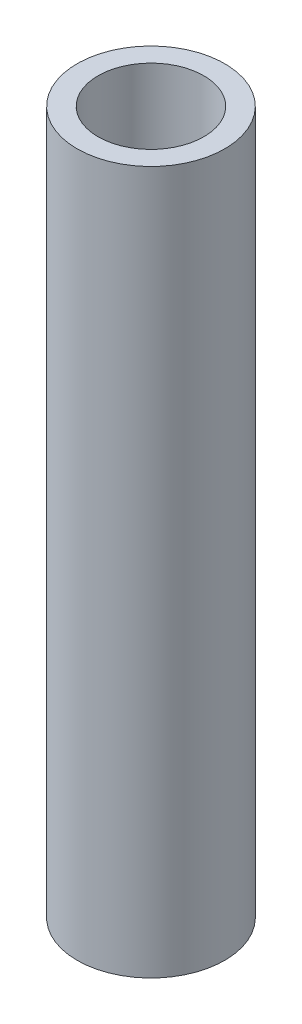
ISO-10303-21;
HEADER;
FILE_DESCRIPTION(('STEP AP214'),'2;1');
FILE_NAME('part.step','',(''),(''),'','','');
FILE_SCHEMA(('AUTOMOTIVE_DESIGN { 1 0 10303 214 1 1 1 1 }'));
ENDSEC;
DATA;
#1=APPLICATION_CONTEXT('core data for automotive mechanical design processes');
#2=APPLICATION_PROTOCOL_DEFINITION('international standard','automotive_design',2000,#1);
#3=PRODUCT_CONTEXT('',#1,'mechanical');
#4=PRODUCT('Part','Part','',(#3));
#5=PRODUCT_RELATED_PRODUCT_CATEGORY('part','',(#4));
#6=PRODUCT_DEFINITION_FORMATION('','',#4);
#7=PRODUCT_DEFINITION_CONTEXT('part definition',#1,'design');
#8=PRODUCT_DEFINITION('design','',#6,#7);
#9=PRODUCT_DEFINITION_SHAPE('','',#8);
#10=(LENGTH_UNIT() NAMED_UNIT(*) SI_UNIT(.MILLI.,.METRE.));
#11=(NAMED_UNIT(*) PLANE_ANGLE_UNIT() SI_UNIT($,.RADIAN.));
#12=(NAMED_UNIT(*) SI_UNIT($,.STERADIAN.) SOLID_ANGLE_UNIT());
#13=UNCERTAINTY_MEASURE_WITH_UNIT(LENGTH_MEASURE(1.E-05),#10,'distance_accuracy_value','');
#14=(GEOMETRIC_REPRESENTATION_CONTEXT(3) GLOBAL_UNCERTAINTY_ASSIGNED_CONTEXT((#13)) GLOBAL_UNIT_ASSIGNED_CONTEXT((#10,
#11,#12)) REPRESENTATION_CONTEXT('',''));
#15=CARTESIAN_POINT('',(0.,0.,0.));
#16=DIRECTION('',(0.,0.,1.));
#17=DIRECTION('',(1.,0.,0.));
#18=AXIS2_PLACEMENT_3D('',#15,#16,#17);
#19=CARTESIAN_POINT('',(0.,101.6,0.));
#20=DIRECTION('',(0.,1.,0.));
#21=DIRECTION('',(0.,0.,1.));
#22=AXIS2_PLACEMENT_3D('',#19,#20,#21);
#23=PLANE('',#22);
#24=CARTESIAN_POINT('',(0.,101.6,0.));
#25=DIRECTION('',(0.,1.,0.));
#26=DIRECTION('',(0.,0.,1.));
#27=AXIS2_PLACEMENT_3D('',#24,#25,#26);
#28=CIRCLE('',#27,10.668);
#29=CARTESIAN_POINT('',(0.,101.6,10.668));
#30=VERTEX_POINT('',#29);
#31=EDGE_CURVE('E10',#30,#30,#28,.T.);
#32=ORIENTED_EDGE('',*,*,#31,.T.);
#33=EDGE_LOOP('',(#32));
#34=FACE_BOUND('',#33,.T.);
#35=CARTESIAN_POINT('',(0.,101.6,0.));
#36=DIRECTION('',(0.,1.,0.));
#37=DIRECTION('',(0.,0.,1.));
#38=AXIS2_PLACEMENT_3D('',#35,#36,#37);
#39=CIRCLE('',#38,7.6454);
#40=CARTESIAN_POINT('',(0.,101.6,7.6454));
#41=VERTEX_POINT('',#40);
#42=EDGE_CURVE('E44',#41,#41,#39,.T.);
#43=ORIENTED_EDGE('',*,*,#42,.F.);
#44=EDGE_LOOP('',(#43));
#45=FACE_BOUND('',#44,.T.);
#46=ADVANCED_FACE('F33',(#34,#45),#23,.T.);
#47=CARTESIAN_POINT('',(0.,0.,0.));
#48=DIRECTION('',(0.,1.,0.));
#49=DIRECTION('',(0.,0.,1.));
#50=AXIS2_PLACEMENT_3D('',#47,#48,#49);
#51=PLANE('',#50);
#52=CARTESIAN_POINT('',(0.,0.,0.));
#53=DIRECTION('',(0.,1.,0.));
#54=DIRECTION('',(0.,0.,1.));
#55=AXIS2_PLACEMENT_3D('',#52,#53,#54);
#56=CIRCLE('',#55,10.668);
#57=CARTESIAN_POINT('',(0.,0.,10.668));
#58=VERTEX_POINT('',#57);
#59=EDGE_CURVE('E37',#58,#58,#56,.T.);
#60=ORIENTED_EDGE('',*,*,#59,.F.);
#61=EDGE_LOOP('',(#60));
#62=FACE_BOUND('',#61,.T.);
#63=CARTESIAN_POINT('',(0.,0.,0.));
#64=DIRECTION('',(0.,1.,0.));
#65=DIRECTION('',(0.,0.,1.));
#66=AXIS2_PLACEMENT_3D('',#63,#64,#65);
#67=CIRCLE('',#66,7.6454);
#68=CARTESIAN_POINT('',(0.,0.,7.6454));
#69=VERTEX_POINT('',#68);
#70=EDGE_CURVE('E46',#69,#69,#67,.T.);
#71=ORIENTED_EDGE('',*,*,#70,.T.);
#72=EDGE_LOOP('',(#71));
#73=FACE_BOUND('',#72,.T.);
#74=ADVANCED_FACE('F56',(#62,#73),#51,.F.);
#75=CARTESIAN_POINT('',(0.,101.6,0.));
#76=DIRECTION('',(0.,-1.,0.));
#77=DIRECTION('',(0.,0.,-1.));
#78=AXIS2_PLACEMENT_3D('',#75,#76,#77);
#79=CYLINDRICAL_SURFACE('',#78,10.668);
#80=ORIENTED_EDGE('',*,*,#31,.F.);
#81=EDGE_LOOP('',(#80));
#82=FACE_BOUND('',#81,.T.);
#83=ORIENTED_EDGE('',*,*,#59,.T.);
#84=EDGE_LOOP('',(#83));
#85=FACE_BOUND('',#84,.T.);
#86=ADVANCED_FACE('F35',(#82,#85),#79,.T.);
#87=CARTESIAN_POINT('',(0.,101.6,0.));
#88=DIRECTION('',(0.,-1.,0.));
#89=DIRECTION('',(0.,0.,-1.));
#90=AXIS2_PLACEMENT_3D('',#87,#88,#89);
#91=CYLINDRICAL_SURFACE('',#90,7.6454);
#92=ORIENTED_EDGE('',*,*,#42,.T.);
#93=EDGE_LOOP('',(#92));
#94=FACE_BOUND('',#93,.T.);
#95=ORIENTED_EDGE('',*,*,#70,.F.);
#96=EDGE_LOOP('',(#95));
#97=FACE_BOUND('',#96,.T.);
#98=ADVANCED_FACE('F52',(#94,#97),#91,.F.);
#99=CLOSED_SHELL('',(#46,#74,#86,#98));
#100=MANIFOLD_SOLID_BREP('B2',#99);
#101=ADVANCED_BREP_SHAPE_REPRESENTATION('',(#18,#100),#14);
#102=SHAPE_DEFINITION_REPRESENTATION(#9,#101);
ENDSEC;
END-ISO-10303-21;
